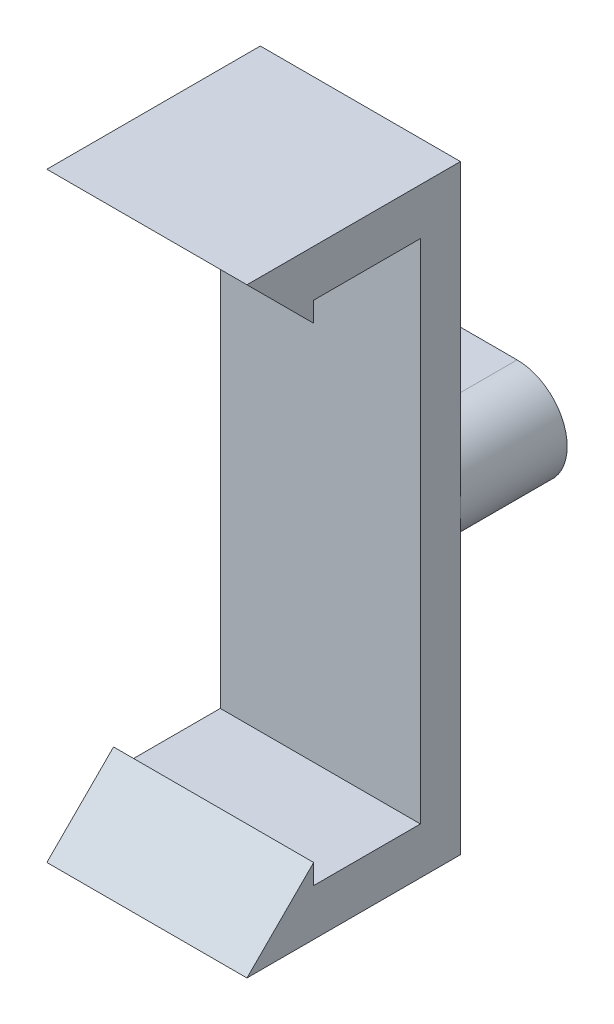
ISO-10303-21;
HEADER;
FILE_DESCRIPTION(('STEP AP214'),'2;1');
FILE_NAME('part.step','',(''),(''),'','','');
FILE_SCHEMA(('AUTOMOTIVE_DESIGN { 1 0 10303 214 1 1 1 1 }'));
ENDSEC;
DATA;
#1=APPLICATION_CONTEXT('core data for automotive mechanical design processes');
#2=APPLICATION_PROTOCOL_DEFINITION('international standard','automotive_design',2000,#1);
#3=PRODUCT_CONTEXT('',#1,'mechanical');
#4=PRODUCT('Part','Part','',(#3));
#5=PRODUCT_RELATED_PRODUCT_CATEGORY('part','',(#4));
#6=PRODUCT_DEFINITION_FORMATION('','',#4);
#7=PRODUCT_DEFINITION_CONTEXT('part definition',#1,'design');
#8=PRODUCT_DEFINITION('design','',#6,#7);
#9=PRODUCT_DEFINITION_SHAPE('','',#8);
#10=(LENGTH_UNIT() NAMED_UNIT(*) SI_UNIT(.MILLI.,.METRE.));
#11=(NAMED_UNIT(*) PLANE_ANGLE_UNIT() SI_UNIT($,.RADIAN.));
#12=(NAMED_UNIT(*) SI_UNIT($,.STERADIAN.) SOLID_ANGLE_UNIT());
#13=UNCERTAINTY_MEASURE_WITH_UNIT(LENGTH_MEASURE(1.E-05),#10,'distance_accuracy_value','');
#14=(GEOMETRIC_REPRESENTATION_CONTEXT(3) GLOBAL_UNCERTAINTY_ASSIGNED_CONTEXT((#13)) GLOBAL_UNIT_ASSIGNED_CONTEXT((#10,
#11,#12)) REPRESENTATION_CONTEXT('',''));
#15=CARTESIAN_POINT('',(0.,0.,0.));
#16=DIRECTION('',(0.,0.,1.));
#17=DIRECTION('',(1.,0.,0.));
#18=AXIS2_PLACEMENT_3D('',#15,#16,#17);
#19=CARTESIAN_POINT('',(0.,0.,0.));
#20=DIRECTION('',(0.,0.,1.));
#21=DIRECTION('',(1.,0.,0.));
#22=AXIS2_PLACEMENT_3D('',#19,#20,#21);
#23=PLANE('',#22);
#24=DIRECTION('',(-1.,0.,0.));
#25=VECTOR('',#24,1.);
#26=CARTESIAN_POINT('',(-1.5,-1.5,0.));
#27=LINE('',#26,#25);
#28=CARTESIAN_POINT('',(1.5,-1.5,0.));
#29=VERTEX_POINT('',#28);
#30=CARTESIAN_POINT('',(-1.5,-1.5,0.));
#31=VERTEX_POINT('',#30);
#32=EDGE_CURVE('E58',#29,#31,#27,.T.);
#33=ORIENTED_EDGE('',*,*,#32,.F.);
#34=CARTESIAN_POINT('',(1.5,0.,0.));
#35=DIRECTION('',(0.,0.,-1.));
#36=DIRECTION('',(1.,0.,0.));
#37=AXIS2_PLACEMENT_3D('',#34,#35,#36);
#38=CIRCLE('',#37,1.5);
#39=CARTESIAN_POINT('',(3.,0.,0.));
#40=VERTEX_POINT('',#39);
#41=EDGE_CURVE('E11',#40,#29,#38,.T.);
#42=ORIENTED_EDGE('',*,*,#41,.F.);
#43=DIRECTION('',(0.,1.,0.));
#44=VECTOR('',#43,1.);
#45=CARTESIAN_POINT('',(3.,9.,0.));
#46=LINE('',#45,#44);
#47=CARTESIAN_POINT('',(3.,-9.,0.));
#48=VERTEX_POINT('',#47);
#49=EDGE_CURVE('E262',#48,#40,#46,.T.);
#50=ORIENTED_EDGE('',*,*,#49,.F.);
#51=DIRECTION('',(1.,0.,0.));
#52=VECTOR('',#51,1.);
#53=CARTESIAN_POINT('',(-3.,-9.,0.));
#54=LINE('',#53,#52);
#55=CARTESIAN_POINT('',(-3.,-9.,0.));
#56=VERTEX_POINT('',#55);
#57=EDGE_CURVE('E257',#56,#48,#54,.T.);
#58=ORIENTED_EDGE('',*,*,#57,.F.);
#59=DIRECTION('',(0.,-1.,0.));
#60=VECTOR('',#59,1.);
#61=CARTESIAN_POINT('',(-3.,9.,0.));
#62=LINE('',#61,#60);
#63=CARTESIAN_POINT('',(-3.,0.,0.));
#64=VERTEX_POINT('',#63);
#65=EDGE_CURVE('E269',#64,#56,#62,.T.);
#66=ORIENTED_EDGE('',*,*,#65,.F.);
#67=CARTESIAN_POINT('',(-1.5,0.,0.));
#68=DIRECTION('',(0.,0.,-1.));
#69=DIRECTION('',(-1.,0.,0.));
#70=AXIS2_PLACEMENT_3D('',#67,#68,#69);
#71=CIRCLE('',#70,1.5);
#72=EDGE_CURVE('E62',#31,#64,#71,.T.);
#73=ORIENTED_EDGE('',*,*,#72,.F.);
#74=EDGE_LOOP('',(#33,#42,#50,#58,#66,#73));
#75=FACE_BOUND('',#74,.T.);
#76=ADVANCED_FACE('F39',(#75),#23,.F.);
#77=CARTESIAN_POINT('',(-1.5,1.5,0.));
#78=VERTEX_POINT('',#77);
#79=EDGE_CURVE('E49',#64,#78,#71,.T.);
#80=ORIENTED_EDGE('',*,*,#79,.F.);
#81=CARTESIAN_POINT('',(-3.,9.,0.));
#82=VERTEX_POINT('',#81);
#83=EDGE_CURVE('E270',#82,#64,#62,.T.);
#84=ORIENTED_EDGE('',*,*,#83,.F.);
#85=DIRECTION('',(-1.,0.,0.));
#86=VECTOR('',#85,1.);
#87=CARTESIAN_POINT('',(-3.,9.,0.));
#88=LINE('',#87,#86);
#89=CARTESIAN_POINT('',(3.,9.,0.));
#90=VERTEX_POINT('',#89);
#91=EDGE_CURVE('E266',#90,#82,#88,.T.);
#92=ORIENTED_EDGE('',*,*,#91,.F.);
#93=EDGE_CURVE('E252',#40,#90,#46,.T.);
#94=ORIENTED_EDGE('',*,*,#93,.F.);
#95=CARTESIAN_POINT('',(1.5,1.5,0.));
#96=VERTEX_POINT('',#95);
#97=EDGE_CURVE('E51',#96,#40,#38,.T.);
#98=ORIENTED_EDGE('',*,*,#97,.F.);
#99=DIRECTION('',(1.,0.,0.));
#100=VECTOR('',#99,1.);
#101=CARTESIAN_POINT('',(-1.5,1.5,0.));
#102=LINE('',#101,#100);
#103=EDGE_CURVE('E298',#78,#96,#102,.T.);
#104=ORIENTED_EDGE('',*,*,#103,.F.);
#105=EDGE_LOOP('',(#80,#84,#92,#94,#98,#104));
#106=FACE_BOUND('',#105,.T.);
#107=ADVANCED_FACE('F327',(#106),#23,.F.);
#108=CARTESIAN_POINT('',(0.,0.,1.2));
#109=DIRECTION('',(0.,0.,1.));
#110=DIRECTION('',(1.,0.,0.));
#111=AXIS2_PLACEMENT_3D('',#108,#109,#110);
#112=PLANE('',#111);
#113=DIRECTION('',(0.,-1.,0.));
#114=VECTOR('',#113,1.);
#115=CARTESIAN_POINT('',(-3.,9.,1.2));
#116=LINE('',#115,#114);
#117=CARTESIAN_POINT('',(-3.,7.6,1.2));
#118=VERTEX_POINT('',#117);
#119=CARTESIAN_POINT('',(-3.,-7.6,1.2));
#120=VERTEX_POINT('',#119);
#121=EDGE_CURVE('E256',#118,#120,#116,.T.);
#122=ORIENTED_EDGE('',*,*,#121,.T.);
#123=DIRECTION('',(-1.,0.,0.));
#124=VECTOR('',#123,1.);
#125=CARTESIAN_POINT('',(-3.,-7.6,1.2));
#126=LINE('',#125,#124);
#127=CARTESIAN_POINT('',(3.,-7.6,1.2));
#128=VERTEX_POINT('',#127);
#129=EDGE_CURVE('E212',#128,#120,#126,.T.);
#130=ORIENTED_EDGE('',*,*,#129,.F.);
#131=DIRECTION('',(0.,1.,0.));
#132=VECTOR('',#131,1.);
#133=CARTESIAN_POINT('',(3.,9.,1.2));
#134=LINE('',#133,#132);
#135=CARTESIAN_POINT('',(3.,7.6,1.2));
#136=VERTEX_POINT('',#135);
#137=EDGE_CURVE('E253',#128,#136,#134,.T.);
#138=ORIENTED_EDGE('',*,*,#137,.T.);
#139=DIRECTION('',(1.,0.,0.));
#140=VECTOR('',#139,1.);
#141=CARTESIAN_POINT('',(-3.,7.6,1.2));
#142=LINE('',#141,#140);
#143=EDGE_CURVE('E236',#118,#136,#142,.T.);
#144=ORIENTED_EDGE('',*,*,#143,.F.);
#145=EDGE_LOOP('',(#122,#130,#138,#144));
#146=FACE_BOUND('',#145,.T.);
#147=ADVANCED_FACE('F353',(#146),#112,.T.);
#148=CARTESIAN_POINT('',(3.,9.,1.2));
#149=DIRECTION('',(-1.,0.,0.));
#150=DIRECTION('',(0.,-1.,0.));
#151=AXIS2_PLACEMENT_3D('',#148,#149,#150);
#152=PLANE('',#151);
#153=DIRECTION('',(0.,1.,0.));
#154=VECTOR('',#153,1.);
#155=CARTESIAN_POINT('',(3.,-9.,4.4));
#156=LINE('',#155,#154);
#157=CARTESIAN_POINT('',(3.,-7.6,4.4));
#158=VERTEX_POINT('',#157);
#159=CARTESIAN_POINT('',(3.,-7.,4.4));
#160=VERTEX_POINT('',#159);
#161=EDGE_CURVE('E196',#158,#160,#156,.T.);
#162=ORIENTED_EDGE('',*,*,#161,.T.);
#163=DIRECTION('',(0.,-0.707106781186548,0.707106781186548));
#164=VECTOR('',#163,1.);
#165=CARTESIAN_POINT('',(3.,-9.,6.4));
#166=LINE('',#165,#164);
#167=CARTESIAN_POINT('',(3.,-9.,6.4));
#168=VERTEX_POINT('',#167);
#169=EDGE_CURVE('E178',#160,#168,#166,.T.);
#170=ORIENTED_EDGE('',*,*,#169,.T.);
#171=DIRECTION('',(0.,0.,-1.));
#172=VECTOR('',#171,1.);
#173=CARTESIAN_POINT('',(3.,-9.,1.2));
#174=LINE('',#173,#172);
#175=EDGE_CURVE('E261',#168,#48,#174,.T.);
#176=ORIENTED_EDGE('',*,*,#175,.T.);
#177=ORIENTED_EDGE('',*,*,#49,.T.);
#178=ORIENTED_EDGE('',*,*,#93,.T.);
#179=DIRECTION('',(0.,0.,-1.));
#180=VECTOR('',#179,1.);
#181=CARTESIAN_POINT('',(3.,9.,1.2));
#182=LINE('',#181,#180);
#183=CARTESIAN_POINT('',(3.,9.,6.4));
#184=VERTEX_POINT('',#183);
#185=EDGE_CURVE('E43',#184,#90,#182,.T.);
#186=ORIENTED_EDGE('',*,*,#185,.F.);
#187=DIRECTION('',(0.,0.707106781186548,0.707106781186548));
#188=VECTOR('',#187,1.);
#189=CARTESIAN_POINT('',(3.,9.,6.4));
#190=LINE('',#189,#188);
#191=CARTESIAN_POINT('',(3.,7.,4.4));
#192=VERTEX_POINT('',#191);
#193=EDGE_CURVE('E191',#192,#184,#190,.T.);
#194=ORIENTED_EDGE('',*,*,#193,.F.);
#195=DIRECTION('',(0.,1.,0.));
#196=VECTOR('',#195,1.);
#197=CARTESIAN_POINT('',(3.,9.,4.4));
#198=LINE('',#197,#196);
#199=CARTESIAN_POINT('',(3.,7.6,4.4));
#200=VERTEX_POINT('',#199);
#201=EDGE_CURVE('E213',#192,#200,#198,.T.);
#202=ORIENTED_EDGE('',*,*,#201,.T.);
#203=DIRECTION('',(0.,0.,-1.));
#204=VECTOR('',#203,1.);
#205=CARTESIAN_POINT('',(3.,7.6,4.4));
#206=LINE('',#205,#204);
#207=EDGE_CURVE('E241',#200,#136,#206,.T.);
#208=ORIENTED_EDGE('',*,*,#207,.T.);
#209=ORIENTED_EDGE('',*,*,#137,.F.);
#210=DIRECTION('',(0.,0.,-1.));
#211=VECTOR('',#210,1.);
#212=CARTESIAN_POINT('',(3.,-7.6,4.4));
#213=LINE('',#212,#211);
#214=EDGE_CURVE('E233',#158,#128,#213,.T.);
#215=ORIENTED_EDGE('',*,*,#214,.F.);
#216=EDGE_LOOP('',(#162,#170,#176,#177,#178,#186,#194,#202,#208,#209,#215));
#217=FACE_BOUND('',#216,.T.);
#218=ADVANCED_FACE('F41',(#217),#152,.F.);
#219=CARTESIAN_POINT('',(-3.,9.,1.2));
#220=DIRECTION('',(0.,-1.,0.));
#221=DIRECTION('',(0.,0.,-1.));
#222=AXIS2_PLACEMENT_3D('',#219,#220,#221);
#223=PLANE('',#222);
#224=ORIENTED_EDGE('',*,*,#91,.T.);
#225=DIRECTION('',(0.,0.,-1.));
#226=VECTOR('',#225,1.);
#227=CARTESIAN_POINT('',(-3.,9.,1.2));
#228=LINE('',#227,#226);
#229=CARTESIAN_POINT('',(-3.,9.,6.4));
#230=VERTEX_POINT('',#229);
#231=EDGE_CURVE('E282',#230,#82,#228,.T.);
#232=ORIENTED_EDGE('',*,*,#231,.F.);
#233=DIRECTION('',(-1.,0.,0.));
#234=VECTOR('',#233,1.);
#235=CARTESIAN_POINT('',(-3.,9.,6.4));
#236=LINE('',#235,#234);
#237=EDGE_CURVE('E209',#184,#230,#236,.T.);
#238=ORIENTED_EDGE('',*,*,#237,.F.);
#239=ORIENTED_EDGE('',*,*,#185,.T.);
#240=EDGE_LOOP('',(#224,#232,#238,#239));
#241=FACE_BOUND('',#240,.T.);
#242=ADVANCED_FACE('F366',(#241),#223,.F.);
#243=CARTESIAN_POINT('',(-3.,9.,1.2));
#244=DIRECTION('',(1.,0.,0.));
#245=DIRECTION('',(0.,1.,0.));
#246=AXIS2_PLACEMENT_3D('',#243,#244,#245);
#247=PLANE('',#246);
#248=DIRECTION('',(0.,0.,-1.));
#249=VECTOR('',#248,1.);
#250=CARTESIAN_POINT('',(-3.,-9.,1.2));
#251=LINE('',#250,#249);
#252=CARTESIAN_POINT('',(-3.,-9.,6.4));
#253=VERTEX_POINT('',#252);
#254=EDGE_CURVE('E279',#253,#56,#251,.T.);
#255=ORIENTED_EDGE('',*,*,#254,.F.);
#256=DIRECTION('',(0.,-0.707106781186548,0.707106781186548));
#257=VECTOR('',#256,1.);
#258=CARTESIAN_POINT('',(-3.,-9.,6.4));
#259=LINE('',#258,#257);
#260=CARTESIAN_POINT('',(-3.,-7.,4.4));
#261=VERTEX_POINT('',#260);
#262=EDGE_CURVE('E174',#261,#253,#259,.T.);
#263=ORIENTED_EDGE('',*,*,#262,.F.);
#264=DIRECTION('',(0.,-1.,0.));
#265=VECTOR('',#264,1.);
#266=CARTESIAN_POINT('',(-3.,-9.,4.4));
#267=LINE('',#266,#265);
#268=CARTESIAN_POINT('',(-3.,-7.6,4.4));
#269=VERTEX_POINT('',#268);
#270=EDGE_CURVE('E186',#261,#269,#267,.T.);
#271=ORIENTED_EDGE('',*,*,#270,.T.);
#272=DIRECTION('',(0.,0.,-1.));
#273=VECTOR('',#272,1.);
#274=CARTESIAN_POINT('',(-3.,-7.6,4.4));
#275=LINE('',#274,#273);
#276=EDGE_CURVE('E227',#269,#120,#275,.T.);
#277=ORIENTED_EDGE('',*,*,#276,.T.);
#278=ORIENTED_EDGE('',*,*,#121,.F.);
#279=DIRECTION('',(0.,0.,-1.));
#280=VECTOR('',#279,1.);
#281=CARTESIAN_POINT('',(-3.,7.6,4.4));
#282=LINE('',#281,#280);
#283=CARTESIAN_POINT('',(-3.,7.6,4.4));
#284=VERTEX_POINT('',#283);
#285=EDGE_CURVE('E248',#284,#118,#282,.T.);
#286=ORIENTED_EDGE('',*,*,#285,.F.);
#287=DIRECTION('',(0.,-1.,0.));
#288=VECTOR('',#287,1.);
#289=CARTESIAN_POINT('',(-3.,9.,4.4));
#290=LINE('',#289,#288);
#291=CARTESIAN_POINT('',(-3.,7.,4.4));
#292=VERTEX_POINT('',#291);
#293=EDGE_CURVE('E206',#284,#292,#290,.T.);
#294=ORIENTED_EDGE('',*,*,#293,.T.);
#295=DIRECTION('',(0.,0.707106781186548,0.707106781186548));
#296=VECTOR('',#295,1.);
#297=CARTESIAN_POINT('',(-3.,9.,6.4));
#298=LINE('',#297,#296);
#299=EDGE_CURVE('E202',#292,#230,#298,.T.);
#300=ORIENTED_EDGE('',*,*,#299,.T.);
#301=ORIENTED_EDGE('',*,*,#231,.T.);
#302=ORIENTED_EDGE('',*,*,#83,.T.);
#303=ORIENTED_EDGE('',*,*,#65,.T.);
#304=EDGE_LOOP('',(#255,#263,#271,#277,#278,#286,#294,#300,#301,#302,#303));
#305=FACE_BOUND('',#304,.T.);
#306=ADVANCED_FACE('F339',(#305),#247,.F.);
#307=CARTESIAN_POINT('',(-3.,-9.,1.2));
#308=DIRECTION('',(0.,1.,0.));
#309=DIRECTION('',(0.,0.,1.));
#310=AXIS2_PLACEMENT_3D('',#307,#308,#309);
#311=PLANE('',#310);
#312=ORIENTED_EDGE('',*,*,#57,.T.);
#313=ORIENTED_EDGE('',*,*,#175,.F.);
#314=DIRECTION('',(1.,0.,0.));
#315=VECTOR('',#314,1.);
#316=CARTESIAN_POINT('',(-3.,-9.,6.4));
#317=LINE('',#316,#315);
#318=EDGE_CURVE('E188',#253,#168,#317,.T.);
#319=ORIENTED_EDGE('',*,*,#318,.F.);
#320=ORIENTED_EDGE('',*,*,#254,.T.);
#321=EDGE_LOOP('',(#312,#313,#319,#320));
#322=FACE_BOUND('',#321,.T.);
#323=ADVANCED_FACE('F335',(#322),#311,.F.);
#324=CARTESIAN_POINT('',(-3.,7.6,4.4));
#325=DIRECTION('',(0.,1.,0.));
#326=DIRECTION('',(0.,0.,1.));
#327=AXIS2_PLACEMENT_3D('',#324,#325,#326);
#328=PLANE('',#327);
#329=ORIENTED_EDGE('',*,*,#143,.T.);
#330=ORIENTED_EDGE('',*,*,#207,.F.);
#331=DIRECTION('',(1.,0.,0.));
#332=VECTOR('',#331,1.);
#333=CARTESIAN_POINT('',(-3.,7.6,4.4));
#334=LINE('',#333,#332);
#335=EDGE_CURVE('E237',#284,#200,#334,.T.);
#336=ORIENTED_EDGE('',*,*,#335,.F.);
#337=ORIENTED_EDGE('',*,*,#285,.T.);
#338=EDGE_LOOP('',(#329,#330,#336,#337));
#339=FACE_BOUND('',#338,.T.);
#340=ADVANCED_FACE('F356',(#339),#328,.F.);
#341=CARTESIAN_POINT('',(-3.,-7.6,4.4));
#342=DIRECTION('',(0.,-1.,0.));
#343=DIRECTION('',(0.,0.,-1.));
#344=AXIS2_PLACEMENT_3D('',#341,#342,#343);
#345=PLANE('',#344);
#346=ORIENTED_EDGE('',*,*,#129,.T.);
#347=ORIENTED_EDGE('',*,*,#276,.F.);
#348=DIRECTION('',(-1.,0.,0.));
#349=VECTOR('',#348,1.);
#350=CARTESIAN_POINT('',(-3.,-7.6,4.4));
#351=LINE('',#350,#349);
#352=EDGE_CURVE('E223',#158,#269,#351,.T.);
#353=ORIENTED_EDGE('',*,*,#352,.F.);
#354=ORIENTED_EDGE('',*,*,#214,.T.);
#355=EDGE_LOOP('',(#346,#347,#353,#354));
#356=FACE_BOUND('',#355,.T.);
#357=ADVANCED_FACE('F349',(#356),#345,.F.);
#358=CARTESIAN_POINT('',(0.,0.,4.4));
#359=DIRECTION('',(0.,0.,1.));
#360=DIRECTION('',(1.,0.,0.));
#361=AXIS2_PLACEMENT_3D('',#358,#359,#360);
#362=PLANE('',#361);
#363=ORIENTED_EDGE('',*,*,#293,.F.);
#364=ORIENTED_EDGE('',*,*,#335,.T.);
#365=ORIENTED_EDGE('',*,*,#201,.F.);
#366=DIRECTION('',(1.,0.,0.));
#367=VECTOR('',#366,1.);
#368=CARTESIAN_POINT('',(-3.,7.,4.4));
#369=LINE('',#368,#367);
#370=EDGE_CURVE('E217',#292,#192,#369,.T.);
#371=ORIENTED_EDGE('',*,*,#370,.F.);
#372=EDGE_LOOP('',(#363,#364,#365,#371));
#373=FACE_BOUND('',#372,.T.);
#374=ADVANCED_FACE('F361',(#373),#362,.F.);
#375=CARTESIAN_POINT('',(-3.,9.,6.4));
#376=DIRECTION('',(0.,0.707106781186547,-0.707106781186547));
#377=DIRECTION('',(0.,0.707106781186548,0.707106781186548));
#378=AXIS2_PLACEMENT_3D('',#375,#376,#377);
#379=PLANE('',#378);
#380=ORIENTED_EDGE('',*,*,#193,.T.);
#381=ORIENTED_EDGE('',*,*,#237,.T.);
#382=ORIENTED_EDGE('',*,*,#299,.F.);
#383=ORIENTED_EDGE('',*,*,#370,.T.);
#384=EDGE_LOOP('',(#380,#381,#382,#383));
#385=FACE_BOUND('',#384,.T.);
#386=ADVANCED_FACE('F365',(#385),#379,.F.);
#387=CARTESIAN_POINT('',(0.,0.,4.4));
#388=DIRECTION('',(0.,0.,-1.));
#389=DIRECTION('',(-1.,0.,0.));
#390=AXIS2_PLACEMENT_3D('',#387,#388,#389);
#391=PLANE('',#390);
#392=ORIENTED_EDGE('',*,*,#352,.T.);
#393=ORIENTED_EDGE('',*,*,#270,.F.);
#394=DIRECTION('',(-1.,0.,0.));
#395=VECTOR('',#394,1.);
#396=CARTESIAN_POINT('',(-3.,-7.,4.4));
#397=LINE('',#396,#395);
#398=EDGE_CURVE('E192',#160,#261,#397,.T.);
#399=ORIENTED_EDGE('',*,*,#398,.F.);
#400=ORIENTED_EDGE('',*,*,#161,.F.);
#401=EDGE_LOOP('',(#392,#393,#399,#400));
#402=FACE_BOUND('',#401,.T.);
#403=ADVANCED_FACE('F345',(#402),#391,.T.);
#404=CARTESIAN_POINT('',(3.,-9.,6.4));
#405=DIRECTION('',(0.,-0.707106781186547,-0.707106781186547));
#406=DIRECTION('',(0.,0.707106781186548,-0.707106781186548));
#407=AXIS2_PLACEMENT_3D('',#404,#405,#406);
#408=PLANE('',#407);
#409=ORIENTED_EDGE('',*,*,#262,.T.);
#410=ORIENTED_EDGE('',*,*,#318,.T.);
#411=ORIENTED_EDGE('',*,*,#169,.F.);
#412=ORIENTED_EDGE('',*,*,#398,.T.);
#413=EDGE_LOOP('',(#409,#410,#411,#412));
#414=FACE_BOUND('',#413,.T.);
#415=ADVANCED_FACE('F396',(#414),#408,.F.);
#416=CARTESIAN_POINT('',(-1.5,0.,-3.2));
#417=DIRECTION('',(0.,0.,1.));
#418=DIRECTION('',(1.,0.,0.));
#419=AXIS2_PLACEMENT_3D('',#416,#417,#418);
#420=CYLINDRICAL_SURFACE('',#419,1.5);
#421=ORIENTED_EDGE('',*,*,#72,.T.);
#422=ORIENTED_EDGE('',*,*,#79,.T.);
#423=DIRECTION('',(0.,0.,1.));
#424=VECTOR('',#423,1.);
#425=CARTESIAN_POINT('',(-1.5,1.5,-3.2));
#426=LINE('',#425,#424);
#427=CARTESIAN_POINT('',(-1.5,1.5,-3.2));
#428=VERTEX_POINT('',#427);
#429=EDGE_CURVE('E153',#428,#78,#426,.T.);
#430=ORIENTED_EDGE('',*,*,#429,.F.);
#431=CARTESIAN_POINT('',(-1.5,0.,-3.2));
#432=DIRECTION('',(0.,0.,-1.));
#433=DIRECTION('',(-1.,0.,0.));
#434=AXIS2_PLACEMENT_3D('',#431,#432,#433);
#435=CIRCLE('',#434,1.5);
#436=CARTESIAN_POINT('',(-1.5,-1.5,-3.2));
#437=VERTEX_POINT('',#436);
#438=EDGE_CURVE('E160',#437,#428,#435,.T.);
#439=ORIENTED_EDGE('',*,*,#438,.F.);
#440=DIRECTION('',(0.,0.,1.));
#441=VECTOR('',#440,1.);
#442=CARTESIAN_POINT('',(-1.5,-1.5,-3.2));
#443=LINE('',#442,#441);
#444=EDGE_CURVE('E313',#437,#31,#443,.T.);
#445=ORIENTED_EDGE('',*,*,#444,.T.);
#446=EDGE_LOOP('',(#421,#422,#430,#439,#445));
#447=FACE_BOUND('',#446,.T.);
#448=ADVANCED_FACE('F172',(#447),#420,.T.);
#449=CARTESIAN_POINT('',(-1.5,1.5,-3.2));
#450=DIRECTION('',(0.,-1.,0.));
#451=DIRECTION('',(1.,0.,0.));
#452=AXIS2_PLACEMENT_3D('',#449,#450,#451);
#453=PLANE('',#452);
#454=ORIENTED_EDGE('',*,*,#103,.T.);
#455=DIRECTION('',(0.,0.,1.));
#456=VECTOR('',#455,1.);
#457=CARTESIAN_POINT('',(1.5,1.5,-3.2));
#458=LINE('',#457,#456);
#459=CARTESIAN_POINT('',(1.5,1.5,-3.2));
#460=VERTEX_POINT('',#459);
#461=EDGE_CURVE('E155',#460,#96,#458,.T.);
#462=ORIENTED_EDGE('',*,*,#461,.F.);
#463=DIRECTION('',(1.,0.,0.));
#464=VECTOR('',#463,1.);
#465=CARTESIAN_POINT('',(-1.5,1.5,-3.2));
#466=LINE('',#465,#464);
#467=EDGE_CURVE('E148',#428,#460,#466,.T.);
#468=ORIENTED_EDGE('',*,*,#467,.F.);
#469=ORIENTED_EDGE('',*,*,#429,.T.);
#470=EDGE_LOOP('',(#454,#462,#468,#469));
#471=FACE_BOUND('',#470,.T.);
#472=ADVANCED_FACE('F151',(#471),#453,.F.);
#473=CARTESIAN_POINT('',(1.5,0.,-3.2));
#474=DIRECTION('',(0.,0.,1.));
#475=DIRECTION('',(1.,0.,0.));
#476=AXIS2_PLACEMENT_3D('',#473,#474,#475);
#477=CYLINDRICAL_SURFACE('',#476,1.5);
#478=ORIENTED_EDGE('',*,*,#97,.T.);
#479=ORIENTED_EDGE('',*,*,#41,.T.);
#480=DIRECTION('',(0.,0.,1.));
#481=VECTOR('',#480,1.);
#482=CARTESIAN_POINT('',(1.5,-1.5,-3.2));
#483=LINE('',#482,#481);
#484=CARTESIAN_POINT('',(1.5,-1.5,-3.2));
#485=VERTEX_POINT('',#484);
#486=EDGE_CURVE('E180',#485,#29,#483,.T.);
#487=ORIENTED_EDGE('',*,*,#486,.F.);
#488=CARTESIAN_POINT('',(1.5,0.,-3.2));
#489=DIRECTION('',(0.,0.,-1.));
#490=DIRECTION('',(1.,0.,0.));
#491=AXIS2_PLACEMENT_3D('',#488,#489,#490);
#492=CIRCLE('',#491,1.5);
#493=EDGE_CURVE('E159',#460,#485,#492,.T.);
#494=ORIENTED_EDGE('',*,*,#493,.F.);
#495=ORIENTED_EDGE('',*,*,#461,.T.);
#496=EDGE_LOOP('',(#478,#479,#487,#494,#495));
#497=FACE_BOUND('',#496,.T.);
#498=ADVANCED_FACE('F323',(#497),#477,.T.);
#499=CARTESIAN_POINT('',(-1.5,-1.5,-3.2));
#500=DIRECTION('',(0.,1.,0.));
#501=DIRECTION('',(-1.,0.,0.));
#502=AXIS2_PLACEMENT_3D('',#499,#500,#501);
#503=PLANE('',#502);
#504=ORIENTED_EDGE('',*,*,#32,.T.);
#505=ORIENTED_EDGE('',*,*,#444,.F.);
#506=DIRECTION('',(-1.,0.,0.));
#507=VECTOR('',#506,1.);
#508=CARTESIAN_POINT('',(-1.5,-1.5,-3.2));
#509=LINE('',#508,#507);
#510=EDGE_CURVE('E165',#485,#437,#509,.T.);
#511=ORIENTED_EDGE('',*,*,#510,.F.);
#512=ORIENTED_EDGE('',*,*,#486,.T.);
#513=EDGE_LOOP('',(#504,#505,#511,#512));
#514=FACE_BOUND('',#513,.T.);
#515=ADVANCED_FACE('F405',(#514),#503,.F.);
#516=CARTESIAN_POINT('',(-1.5,0.,-3.2));
#517=DIRECTION('',(0.,0.,-1.));
#518=DIRECTION('',(-1.,0.,0.));
#519=AXIS2_PLACEMENT_3D('',#516,#517,#518);
#520=PLANE('',#519);
#521=CARTESIAN_POINT('',(0.,0.,-3.2));
#522=DIRECTION('',(0.,0.,-1.));
#523=DIRECTION('',(-1.,0.,0.));
#524=AXIS2_PLACEMENT_3D('',#521,#522,#523);
#525=CIRCLE('',#524,0.75);
#526=CARTESIAN_POINT('',(-0.75,0.,-3.2));
#527=VERTEX_POINT('',#526);
#528=EDGE_CURVE('E303',#527,#527,#525,.T.);
#529=ORIENTED_EDGE('',*,*,#528,.F.);
#530=EDGE_LOOP('',(#529));
#531=FACE_BOUND('',#530,.T.);
#532=ORIENTED_EDGE('',*,*,#438,.T.);
#533=ORIENTED_EDGE('',*,*,#467,.T.);
#534=ORIENTED_EDGE('',*,*,#493,.T.);
#535=ORIENTED_EDGE('',*,*,#510,.T.);
#536=EDGE_LOOP('',(#532,#533,#534,#535));
#537=FACE_BOUND('',#536,.T.);
#538=ADVANCED_FACE('F163',(#531,#537),#520,.T.);
#539=CARTESIAN_POINT('',(0.,0.,0.8));
#540=DIRECTION('',(0.,0.,-1.));
#541=DIRECTION('',(-1.,0.,0.));
#542=AXIS2_PLACEMENT_3D('',#539,#540,#541);
#543=CYLINDRICAL_SURFACE('',#542,0.75);
#544=CARTESIAN_POINT('',(0.,0.,0.8));
#545=DIRECTION('',(0.,0.,-1.));
#546=DIRECTION('',(-1.,0.,0.));
#547=AXIS2_PLACEMENT_3D('',#544,#545,#546);
#548=CIRCLE('',#547,0.75);
#549=CARTESIAN_POINT('',(-0.75,0.,0.8));
#550=VERTEX_POINT('',#549);
#551=EDGE_CURVE('E299',#550,#550,#548,.T.);
#552=ORIENTED_EDGE('',*,*,#551,.F.);
#553=EDGE_LOOP('',(#552));
#554=FACE_BOUND('',#553,.T.);
#555=ORIENTED_EDGE('',*,*,#528,.T.);
#556=EDGE_LOOP('',(#555));
#557=FACE_BOUND('',#556,.T.);
#558=ADVANCED_FACE('F411',(#554,#557),#543,.F.);
#559=CARTESIAN_POINT('',(0.,0.,0.8));
#560=DIRECTION('',(0.,0.,-1.));
#561=DIRECTION('',(-1.,0.,0.));
#562=AXIS2_PLACEMENT_3D('',#559,#560,#561);
#563=PLANE('',#562);
#564=ORIENTED_EDGE('',*,*,#551,.T.);
#565=EDGE_LOOP('',(#564));
#566=FACE_BOUND('',#565,.T.);
#567=ADVANCED_FACE('F415',(#566),#563,.T.);
#568=CLOSED_SHELL('',(#76,#107,#147,#218,#242,#306,#323,#340,#357,#374,#386,#403,#415,#448,#472,
#498,#515,#538,#558,#567));
#569=MANIFOLD_SOLID_BREP('B2',#568);
#570=ADVANCED_BREP_SHAPE_REPRESENTATION('',(#18,#569),#14);
#571=SHAPE_DEFINITION_REPRESENTATION(#9,#570);
ENDSEC;
END-ISO-10303-21;
